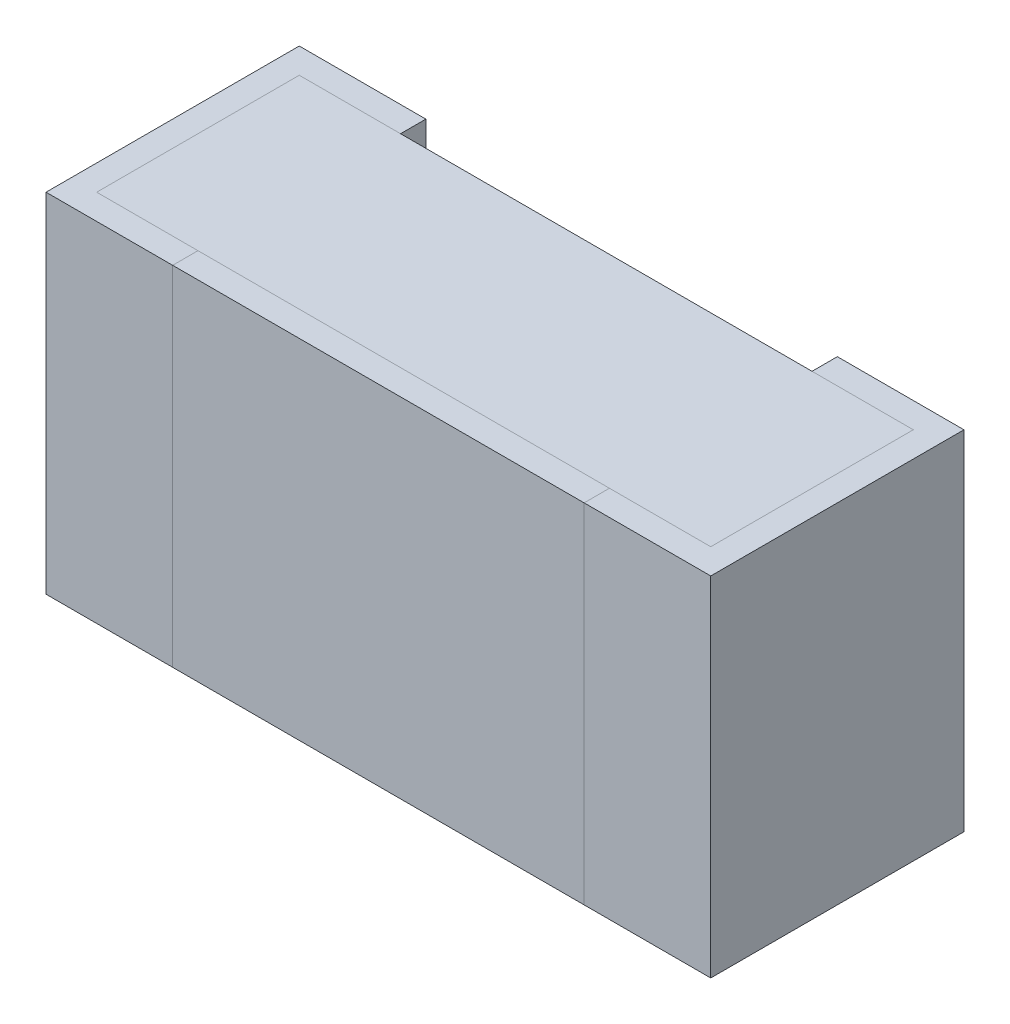
ISO-10303-21;
HEADER;
FILE_DESCRIPTION(('STEP AP214'),'2;1');
FILE_NAME('part.step','',(''),(''),'','','');
FILE_SCHEMA(('AUTOMOTIVE_DESIGN { 1 0 10303 214 1 1 1 1 }'));
ENDSEC;
DATA;
#1=APPLICATION_CONTEXT('core data for automotive mechanical design processes');
#2=APPLICATION_PROTOCOL_DEFINITION('international standard','automotive_design',2000,#1);
#3=PRODUCT_CONTEXT('',#1,'mechanical');
#4=PRODUCT('Part','Part','',(#3));
#5=PRODUCT_RELATED_PRODUCT_CATEGORY('part','',(#4));
#6=PRODUCT_DEFINITION_FORMATION('','',#4);
#7=PRODUCT_DEFINITION_CONTEXT('part definition',#1,'design');
#8=PRODUCT_DEFINITION('design','',#6,#7);
#9=PRODUCT_DEFINITION_SHAPE('','',#8);
#10=(LENGTH_UNIT() NAMED_UNIT(*) SI_UNIT(.MILLI.,.METRE.));
#11=(NAMED_UNIT(*) PLANE_ANGLE_UNIT() SI_UNIT($,.RADIAN.));
#12=(NAMED_UNIT(*) SI_UNIT($,.STERADIAN.) SOLID_ANGLE_UNIT());
#13=UNCERTAINTY_MEASURE_WITH_UNIT(LENGTH_MEASURE(1.E-05),#10,'distance_accuracy_value','');
#14=(GEOMETRIC_REPRESENTATION_CONTEXT(3) GLOBAL_UNCERTAINTY_ASSIGNED_CONTEXT((#13)) GLOBAL_UNIT_ASSIGNED_CONTEXT((#10,
#11,#12)) REPRESENTATION_CONTEXT('',''));
#15=CARTESIAN_POINT('',(0.,0.,0.));
#16=DIRECTION('',(0.,0.,1.));
#17=DIRECTION('',(1.,0.,0.));
#18=AXIS2_PLACEMENT_3D('',#15,#16,#17);
#19=CARTESIAN_POINT('',(-0.462648,-0.21700672,0.04));
#20=DIRECTION('',(1.,0.,0.));
#21=DIRECTION('',(0.,0.,1.));
#22=AXIS2_PLACEMENT_3D('',#19,#20,#21);
#23=PLANE('',#22);
#24=DIRECTION('',(0.,1.,0.));
#25=VECTOR('',#24,1.);
#26=CARTESIAN_POINT('',(-0.462648,-0.21700672,0.36));
#27=LINE('',#26,#25);
#28=CARTESIAN_POINT('',(-0.462648,-0.21700672,0.36));
#29=VERTEX_POINT('',#28);
#30=CARTESIAN_POINT('',(-0.462648,0.33299328,0.36));
#31=VERTEX_POINT('',#30);
#32=EDGE_CURVE('P0_E11',#29,#31,#27,.T.);
#33=ORIENTED_EDGE('',*,*,#32,.T.);
#34=DIRECTION('',(0.,0.,1.));
#35=VECTOR('',#34,1.);
#36=CARTESIAN_POINT('',(-0.462648,0.33299328,0.04));
#37=LINE('',#36,#35);
#38=CARTESIAN_POINT('',(-0.462648,0.33299328,0.04));
#39=VERTEX_POINT('',#38);
#40=EDGE_CURVE('P0_E24',#39,#31,#37,.T.);
#41=ORIENTED_EDGE('',*,*,#40,.F.);
#42=DIRECTION('',(0.,1.,0.));
#43=VECTOR('',#42,1.);
#44=CARTESIAN_POINT('',(-0.462648,-0.21700672,0.04));
#45=LINE('',#44,#43);
#46=CARTESIAN_POINT('',(-0.462648,-0.21700672,0.04));
#47=VERTEX_POINT('',#46);
#48=EDGE_CURVE('P0_E86',#47,#39,#45,.T.);
#49=ORIENTED_EDGE('',*,*,#48,.F.);
#50=DIRECTION('',(0.,0.,1.));
#51=VECTOR('',#50,1.);
#52=CARTESIAN_POINT('',(-0.462648,-0.21700672,0.04));
#53=LINE('',#52,#51);
#54=EDGE_CURVE('P0_E36',#47,#29,#53,.T.);
#55=ORIENTED_EDGE('',*,*,#54,.T.);
#56=EDGE_LOOP('',(#33,#41,#49,#55));
#57=FACE_BOUND('',#56,.T.);
#58=ADVANCED_FACE('P0_F17',(#57),#23,.F.);
#59=CARTESIAN_POINT('',(0.507352,-0.21700672,0.04));
#60=DIRECTION('',(1.,0.,0.));
#61=DIRECTION('',(0.,0.,1.));
#62=AXIS2_PLACEMENT_3D('',#59,#60,#61);
#63=PLANE('',#62);
#64=DIRECTION('',(0.,0.,1.));
#65=VECTOR('',#64,1.);
#66=CARTESIAN_POINT('',(0.507352,-0.21700672,0.04));
#67=LINE('',#66,#65);
#68=CARTESIAN_POINT('',(0.507352,-0.21700672,0.04));
#69=VERTEX_POINT('',#68);
#70=CARTESIAN_POINT('',(0.507352,-0.21700672,0.36));
#71=VERTEX_POINT('',#70);
#72=EDGE_CURVE('P0_E83',#69,#71,#67,.T.);
#73=ORIENTED_EDGE('',*,*,#72,.F.);
#74=DIRECTION('',(0.,1.,0.));
#75=VECTOR('',#74,1.);
#76=CARTESIAN_POINT('',(0.507352,-0.21700672,0.04));
#77=LINE('',#76,#75);
#78=CARTESIAN_POINT('',(0.507352,0.33299328,0.04));
#79=VERTEX_POINT('',#78);
#80=EDGE_CURVE('P0_E63',#69,#79,#77,.T.);
#81=ORIENTED_EDGE('',*,*,#80,.T.);
#82=DIRECTION('',(0.,0.,1.));
#83=VECTOR('',#82,1.);
#84=CARTESIAN_POINT('',(0.507352,0.33299328,0.04));
#85=LINE('',#84,#83);
#86=CARTESIAN_POINT('',(0.507352,0.33299328,0.36));
#87=VERTEX_POINT('',#86);
#88=EDGE_CURVE('P0_E57',#79,#87,#85,.T.);
#89=ORIENTED_EDGE('',*,*,#88,.T.);
#90=DIRECTION('',(0.,1.,0.));
#91=VECTOR('',#90,1.);
#92=CARTESIAN_POINT('',(0.507352,-0.21700672,0.36));
#93=LINE('',#92,#91);
#94=EDGE_CURVE('P0_E60',#71,#87,#93,.T.);
#95=ORIENTED_EDGE('',*,*,#94,.F.);
#96=EDGE_LOOP('',(#73,#81,#89,#95));
#97=FACE_BOUND('',#96,.T.);
#98=ADVANCED_FACE('P0_F59',(#97),#63,.T.);
#99=CARTESIAN_POINT('',(-0.462648,-0.21700672,0.04));
#100=DIRECTION('',(0.,1.,0.));
#101=DIRECTION('',(0.,0.,1.));
#102=AXIS2_PLACEMENT_3D('',#99,#100,#101);
#103=PLANE('',#102);
#104=ORIENTED_EDGE('',*,*,#72,.T.);
#105=DIRECTION('',(1.,0.,0.));
#106=VECTOR('',#105,1.);
#107=CARTESIAN_POINT('',(-0.462648,-0.21700672,0.36));
#108=LINE('',#107,#106);
#109=EDGE_CURVE('P0_E71',#29,#71,#108,.T.);
#110=ORIENTED_EDGE('',*,*,#109,.F.);
#111=ORIENTED_EDGE('',*,*,#54,.F.);
#112=DIRECTION('',(1.,0.,0.));
#113=VECTOR('',#112,1.);
#114=CARTESIAN_POINT('',(-0.462648,-0.21700672,0.04));
#115=LINE('',#114,#113);
#116=EDGE_CURVE('P0_E76',#47,#69,#115,.T.);
#117=ORIENTED_EDGE('',*,*,#116,.T.);
#118=EDGE_LOOP('',(#104,#110,#111,#117));
#119=FACE_BOUND('',#118,.T.);
#120=ADVANCED_FACE('P0_F91',(#119),#103,.F.);
#121=CARTESIAN_POINT('',(-0.462648,0.33299328,0.04));
#122=DIRECTION('',(0.,1.,0.));
#123=DIRECTION('',(0.,0.,1.));
#124=AXIS2_PLACEMENT_3D('',#121,#122,#123);
#125=PLANE('',#124);
#126=DIRECTION('',(1.,0.,0.));
#127=VECTOR('',#126,1.);
#128=CARTESIAN_POINT('',(-0.462648,0.33299328,0.04));
#129=LINE('',#128,#127);
#130=EDGE_CURVE('P0_E74',#39,#79,#129,.T.);
#131=ORIENTED_EDGE('',*,*,#130,.F.);
#132=ORIENTED_EDGE('',*,*,#40,.T.);
#133=DIRECTION('',(1.,0.,0.));
#134=VECTOR('',#133,1.);
#135=CARTESIAN_POINT('',(-0.462648,0.33299328,0.36));
#136=LINE('',#135,#134);
#137=EDGE_CURVE('P0_E69',#31,#87,#136,.T.);
#138=ORIENTED_EDGE('',*,*,#137,.T.);
#139=ORIENTED_EDGE('',*,*,#88,.F.);
#140=EDGE_LOOP('',(#131,#132,#138,#139));
#141=FACE_BOUND('',#140,.T.);
#142=ADVANCED_FACE('P0_F73',(#141),#125,.T.);
#143=CARTESIAN_POINT('',(-0.462648,-0.21700672,0.04));
#144=DIRECTION('',(0.,0.,1.));
#145=DIRECTION('',(1.,0.,0.));
#146=AXIS2_PLACEMENT_3D('',#143,#144,#145);
#147=PLANE('',#146);
#148=ORIENTED_EDGE('',*,*,#130,.T.);
#149=ORIENTED_EDGE('',*,*,#80,.F.);
#150=ORIENTED_EDGE('',*,*,#116,.F.);
#151=ORIENTED_EDGE('',*,*,#48,.T.);
#152=EDGE_LOOP('',(#148,#149,#150,#151));
#153=FACE_BOUND('',#152,.T.);
#154=ADVANCED_FACE('P0_F89',(#153),#147,.F.);
#155=CARTESIAN_POINT('',(-0.462648,-0.21700672,0.36));
#156=DIRECTION('',(0.,0.,1.));
#157=DIRECTION('',(1.,0.,0.));
#158=AXIS2_PLACEMENT_3D('',#155,#156,#157);
#159=PLANE('',#158);
#160=ORIENTED_EDGE('',*,*,#32,.F.);
#161=ORIENTED_EDGE('',*,*,#109,.T.);
#162=ORIENTED_EDGE('',*,*,#94,.T.);
#163=ORIENTED_EDGE('',*,*,#137,.F.);
#164=EDGE_LOOP('',(#160,#161,#162,#163));
#165=FACE_BOUND('',#164,.T.);
#166=ADVANCED_FACE('P0_F68',(#165),#159,.T.);
#167=CLOSED_SHELL('',(#58,#98,#120,#142,#154,#166));
#168=MANIFOLD_SOLID_BREP('P0_B1',#167);
#169=CARTESIAN_POINT('',(-0.502648,-0.21700672,0.));
#170=DIRECTION('',(1.,0.,0.));
#171=DIRECTION('',(0.,0.,1.));
#172=AXIS2_PLACEMENT_3D('',#169,#170,#171);
#173=PLANE('',#172);
#174=DIRECTION('',(0.,1.,0.));
#175=VECTOR('',#174,1.);
#176=CARTESIAN_POINT('',(-0.502648,-0.21700672,0.4));
#177=LINE('',#176,#175);
#178=CARTESIAN_POINT('',(-0.502648,-0.21700672,0.4));
#179=VERTEX_POINT('',#178);
#180=CARTESIAN_POINT('',(-0.502648,0.33299328,0.4));
#181=VERTEX_POINT('',#180);
#182=EDGE_CURVE('P1_E11',#179,#181,#177,.T.);
#183=ORIENTED_EDGE('',*,*,#182,.T.);
#184=DIRECTION('',(0.,0.,1.));
#185=VECTOR('',#184,1.);
#186=CARTESIAN_POINT('',(-0.502648,0.33299328,0.));
#187=LINE('',#186,#185);
#188=CARTESIAN_POINT('',(-0.502648,0.33299328,0.));
#189=VERTEX_POINT('',#188);
#190=EDGE_CURVE('P1_E24',#189,#181,#187,.T.);
#191=ORIENTED_EDGE('',*,*,#190,.F.);
#192=DIRECTION('',(0.,1.,0.));
#193=VECTOR('',#192,1.);
#194=CARTESIAN_POINT('',(-0.502648,-0.21700672,0.));
#195=LINE('',#194,#193);
#196=CARTESIAN_POINT('',(-0.502648,-0.21700672,0.));
#197=VERTEX_POINT('',#196);
#198=EDGE_CURVE('P1_E141',#197,#189,#195,.T.);
#199=ORIENTED_EDGE('',*,*,#198,.F.);
#200=DIRECTION('',(0.,0.,1.));
#201=VECTOR('',#200,1.);
#202=CARTESIAN_POINT('',(-0.502648,-0.21700672,0.));
#203=LINE('',#202,#201);
#204=EDGE_CURVE('P1_E38',#197,#179,#203,.T.);
#205=ORIENTED_EDGE('',*,*,#204,.T.);
#206=EDGE_LOOP('',(#183,#191,#199,#205));
#207=FACE_BOUND('',#206,.T.);
#208=ADVANCED_FACE('P1_F17',(#207),#173,.F.);
#209=CARTESIAN_POINT('',(-0.502648,-0.21700672,0.));
#210=DIRECTION('',(0.,1.,0.));
#211=DIRECTION('',(0.,0.,1.));
#212=AXIS2_PLACEMENT_3D('',#209,#210,#211);
#213=PLANE('',#212);
#214=DIRECTION('',(1.,0.,0.));
#215=VECTOR('',#214,1.);
#216=CARTESIAN_POINT('',(-0.462648,-0.21700672,0.04));
#217=LINE('',#216,#215);
#218=CARTESIAN_POINT('',(-0.462648,-0.21700672,0.04));
#219=VERTEX_POINT('',#218);
#220=CARTESIAN_POINT('',(-0.302648,-0.21700672,0.04));
#221=VERTEX_POINT('',#220);
#222=EDGE_CURVE('P1_E138',#219,#221,#217,.T.);
#223=ORIENTED_EDGE('',*,*,#222,.F.);
#224=DIRECTION('',(0.,0.,1.));
#225=VECTOR('',#224,1.);
#226=CARTESIAN_POINT('',(-0.462648,-0.21700672,0.04));
#227=LINE('',#226,#225);
#228=CARTESIAN_POINT('',(-0.462648,-0.21700672,0.36));
#229=VERTEX_POINT('',#228);
#230=EDGE_CURVE('P1_E99',#219,#229,#227,.T.);
#231=ORIENTED_EDGE('',*,*,#230,.T.);
#232=DIRECTION('',(1.,0.,0.));
#233=VECTOR('',#232,1.);
#234=CARTESIAN_POINT('',(-0.462648,-0.21700672,0.36));
#235=LINE('',#234,#233);
#236=CARTESIAN_POINT('',(-0.302648,-0.21700672,0.36));
#237=VERTEX_POINT('',#236);
#238=EDGE_CURVE('P1_E134',#229,#237,#235,.T.);
#239=ORIENTED_EDGE('',*,*,#238,.T.);
#240=DIRECTION('',(0.,0.,1.));
#241=VECTOR('',#240,1.);
#242=CARTESIAN_POINT('',(-0.302648,-0.21700672,0.));
#243=LINE('',#242,#241);
#244=CARTESIAN_POINT('',(-0.302648,-0.21700672,0.4));
#245=VERTEX_POINT('',#244);
#246=EDGE_CURVE('P1_E131',#237,#245,#243,.T.);
#247=ORIENTED_EDGE('',*,*,#246,.T.);
#248=DIRECTION('',(1.,0.,0.));
#249=VECTOR('',#248,1.);
#250=CARTESIAN_POINT('',(-0.502648,-0.21700672,0.4));
#251=LINE('',#250,#249);
#252=EDGE_CURVE('P1_E129',#179,#245,#251,.T.);
#253=ORIENTED_EDGE('',*,*,#252,.F.);
#254=ORIENTED_EDGE('',*,*,#204,.F.);
#255=DIRECTION('',(1.,0.,0.));
#256=VECTOR('',#255,1.);
#257=CARTESIAN_POINT('',(-0.502648,-0.21700672,0.));
#258=LINE('',#257,#256);
#259=CARTESIAN_POINT('',(-0.302648,-0.21700672,0.));
#260=VERTEX_POINT('',#259);
#261=EDGE_CURVE('P1_E126',#197,#260,#258,.T.);
#262=ORIENTED_EDGE('',*,*,#261,.T.);
#263=DIRECTION('',(0.,0.,1.));
#264=VECTOR('',#263,1.);
#265=CARTESIAN_POINT('',(-0.302648,-0.21700672,0.));
#266=LINE('',#265,#264);
#267=EDGE_CURVE('P1_E123',#260,#221,#266,.T.);
#268=ORIENTED_EDGE('',*,*,#267,.T.);
#269=EDGE_LOOP('',(#223,#231,#239,#247,#253,#254,#262,#268));
#270=FACE_BOUND('',#269,.T.);
#271=ADVANCED_FACE('P1_F147',(#270),#213,.F.);
#272=CARTESIAN_POINT('',(-0.502648,-0.21700672,0.4));
#273=DIRECTION('',(0.,0.,1.));
#274=DIRECTION('',(1.,0.,0.));
#275=AXIS2_PLACEMENT_3D('',#272,#273,#274);
#276=PLANE('',#275);
#277=ORIENTED_EDGE('',*,*,#182,.F.);
#278=ORIENTED_EDGE('',*,*,#252,.T.);
#279=DIRECTION('',(0.,1.,0.));
#280=VECTOR('',#279,1.);
#281=CARTESIAN_POINT('',(-0.302648,-0.21700672,0.4));
#282=LINE('',#281,#280);
#283=CARTESIAN_POINT('',(-0.302648,0.33299328,0.4));
#284=VERTEX_POINT('',#283);
#285=EDGE_CURVE('P1_E121',#245,#284,#282,.T.);
#286=ORIENTED_EDGE('',*,*,#285,.T.);
#287=DIRECTION('',(1.,0.,0.));
#288=VECTOR('',#287,1.);
#289=CARTESIAN_POINT('',(-0.502648,0.33299328,0.4));
#290=LINE('',#289,#288);
#291=EDGE_CURVE('P1_E31',#181,#284,#290,.T.);
#292=ORIENTED_EDGE('',*,*,#291,.F.);
#293=EDGE_LOOP('',(#277,#278,#286,#292));
#294=FACE_BOUND('',#293,.T.);
#295=ADVANCED_FACE('P1_F144',(#294),#276,.T.);
#296=CARTESIAN_POINT('',(-0.502648,0.33299328,0.));
#297=DIRECTION('',(0.,1.,0.));
#298=DIRECTION('',(0.,0.,1.));
#299=AXIS2_PLACEMENT_3D('',#296,#297,#298);
#300=PLANE('',#299);
#301=DIRECTION('',(0.,0.,1.));
#302=VECTOR('',#301,1.);
#303=CARTESIAN_POINT('',(-0.302648,0.33299328,0.));
#304=LINE('',#303,#302);
#305=CARTESIAN_POINT('',(-0.302648,0.33299328,0.));
#306=VERTEX_POINT('',#305);
#307=CARTESIAN_POINT('',(-0.302648,0.33299328,0.04));
#308=VERTEX_POINT('',#307);
#309=EDGE_CURVE('P1_E118',#306,#308,#304,.T.);
#310=ORIENTED_EDGE('',*,*,#309,.F.);
#311=DIRECTION('',(1.,0.,0.));
#312=VECTOR('',#311,1.);
#313=CARTESIAN_POINT('',(-0.502648,0.33299328,0.));
#314=LINE('',#313,#312);
#315=EDGE_CURVE('P1_E115',#189,#306,#314,.T.);
#316=ORIENTED_EDGE('',*,*,#315,.F.);
#317=ORIENTED_EDGE('',*,*,#190,.T.);
#318=ORIENTED_EDGE('',*,*,#291,.T.);
#319=DIRECTION('',(0.,0.,1.));
#320=VECTOR('',#319,1.);
#321=CARTESIAN_POINT('',(-0.302648,0.33299328,0.));
#322=LINE('',#321,#320);
#323=CARTESIAN_POINT('',(-0.302648,0.33299328,0.36));
#324=VERTEX_POINT('',#323);
#325=EDGE_CURVE('P1_E109',#324,#284,#322,.T.);
#326=ORIENTED_EDGE('',*,*,#325,.F.);
#327=DIRECTION('',(1.,0.,0.));
#328=VECTOR('',#327,1.);
#329=CARTESIAN_POINT('',(-0.462648,0.33299328,0.36));
#330=LINE('',#329,#328);
#331=CARTESIAN_POINT('',(-0.462648,0.33299328,0.36));
#332=VERTEX_POINT('',#331);
#333=EDGE_CURVE('P1_E107',#332,#324,#330,.T.);
#334=ORIENTED_EDGE('',*,*,#333,.F.);
#335=DIRECTION('',(0.,0.,1.));
#336=VECTOR('',#335,1.);
#337=CARTESIAN_POINT('',(-0.462648,0.33299328,0.04));
#338=LINE('',#337,#336);
#339=CARTESIAN_POINT('',(-0.462648,0.33299328,0.04));
#340=VERTEX_POINT('',#339);
#341=EDGE_CURVE('P1_E92',#340,#332,#338,.T.);
#342=ORIENTED_EDGE('',*,*,#341,.F.);
#343=DIRECTION('',(1.,0.,0.));
#344=VECTOR('',#343,1.);
#345=CARTESIAN_POINT('',(-0.462648,0.33299328,0.04));
#346=LINE('',#345,#344);
#347=EDGE_CURVE('P1_E81',#340,#308,#346,.T.);
#348=ORIENTED_EDGE('',*,*,#347,.T.);
#349=EDGE_LOOP('',(#310,#316,#317,#318,#326,#334,#342,#348));
#350=FACE_BOUND('',#349,.T.);
#351=ADVANCED_FACE('P1_F104',(#350),#300,.T.);
#352=CARTESIAN_POINT('',(-0.502648,-0.21700672,0.));
#353=DIRECTION('',(0.,0.,1.));
#354=DIRECTION('',(1.,0.,0.));
#355=AXIS2_PLACEMENT_3D('',#352,#353,#354);
#356=PLANE('',#355);
#357=ORIENTED_EDGE('',*,*,#315,.T.);
#358=DIRECTION('',(0.,1.,0.));
#359=VECTOR('',#358,1.);
#360=CARTESIAN_POINT('',(-0.302648,-0.21700672,0.));
#361=LINE('',#360,#359);
#362=EDGE_CURVE('P1_E93',#260,#306,#361,.T.);
#363=ORIENTED_EDGE('',*,*,#362,.F.);
#364=ORIENTED_EDGE('',*,*,#261,.F.);
#365=ORIENTED_EDGE('',*,*,#198,.T.);
#366=EDGE_LOOP('',(#357,#363,#364,#365));
#367=FACE_BOUND('',#366,.T.);
#368=ADVANCED_FACE('P1_F163',(#367),#356,.F.);
#369=CARTESIAN_POINT('',(-0.302648,-0.21700672,0.));
#370=DIRECTION('',(1.,0.,0.));
#371=DIRECTION('',(0.,0.,1.));
#372=AXIS2_PLACEMENT_3D('',#369,#370,#371);
#373=PLANE('',#372);
#374=ORIENTED_EDGE('',*,*,#267,.F.);
#375=ORIENTED_EDGE('',*,*,#362,.T.);
#376=ORIENTED_EDGE('',*,*,#309,.T.);
#377=DIRECTION('',(0.,-1.,0.));
#378=VECTOR('',#377,1.);
#379=CARTESIAN_POINT('',(-0.302648,-0.21700672,0.04));
#380=LINE('',#379,#378);
#381=EDGE_CURVE('P1_E87',#308,#221,#380,.T.);
#382=ORIENTED_EDGE('',*,*,#381,.T.);
#383=EDGE_LOOP('',(#374,#375,#376,#382));
#384=FACE_BOUND('',#383,.T.);
#385=ADVANCED_FACE('P1_F160',(#384),#373,.T.);
#386=CARTESIAN_POINT('',(-0.462648,-0.21700672,0.04));
#387=DIRECTION('',(0.,0.,1.));
#388=DIRECTION('',(1.,0.,0.));
#389=AXIS2_PLACEMENT_3D('',#386,#387,#388);
#390=PLANE('',#389);
#391=ORIENTED_EDGE('',*,*,#347,.F.);
#392=DIRECTION('',(0.,1.,0.));
#393=VECTOR('',#392,1.);
#394=CARTESIAN_POINT('',(-0.462648,-0.21700672,0.04));
#395=LINE('',#394,#393);
#396=EDGE_CURVE('P1_E84',#219,#340,#395,.T.);
#397=ORIENTED_EDGE('',*,*,#396,.F.);
#398=ORIENTED_EDGE('',*,*,#222,.T.);
#399=ORIENTED_EDGE('',*,*,#381,.F.);
#400=EDGE_LOOP('',(#391,#397,#398,#399));
#401=FACE_BOUND('',#400,.T.);
#402=ADVANCED_FACE('P1_F83',(#401),#390,.T.);
#403=CARTESIAN_POINT('',(-0.462648,-0.21700672,0.04));
#404=DIRECTION('',(1.,0.,0.));
#405=DIRECTION('',(0.,0.,1.));
#406=AXIS2_PLACEMENT_3D('',#403,#404,#405);
#407=PLANE('',#406);
#408=ORIENTED_EDGE('',*,*,#230,.F.);
#409=ORIENTED_EDGE('',*,*,#396,.T.);
#410=ORIENTED_EDGE('',*,*,#341,.T.);
#411=DIRECTION('',(0.,1.,0.));
#412=VECTOR('',#411,1.);
#413=CARTESIAN_POINT('',(-0.462648,-0.21700672,0.36));
#414=LINE('',#413,#412);
#415=EDGE_CURVE('P1_E101',#229,#332,#414,.T.);
#416=ORIENTED_EDGE('',*,*,#415,.F.);
#417=EDGE_LOOP('',(#408,#409,#410,#416));
#418=FACE_BOUND('',#417,.T.);
#419=ADVANCED_FACE('P1_F97',(#418),#407,.T.);
#420=CARTESIAN_POINT('',(-0.462648,-0.21700672,0.36));
#421=DIRECTION('',(0.,0.,1.));
#422=DIRECTION('',(1.,0.,0.));
#423=AXIS2_PLACEMENT_3D('',#420,#421,#422);
#424=PLANE('',#423);
#425=DIRECTION('',(0.,-1.,0.));
#426=VECTOR('',#425,1.);
#427=CARTESIAN_POINT('',(-0.302648,-0.21700672,0.36));
#428=LINE('',#427,#426);
#429=EDGE_CURVE('P1_E152',#324,#237,#428,.T.);
#430=ORIENTED_EDGE('',*,*,#429,.T.);
#431=ORIENTED_EDGE('',*,*,#238,.F.);
#432=ORIENTED_EDGE('',*,*,#415,.T.);
#433=ORIENTED_EDGE('',*,*,#333,.T.);
#434=EDGE_LOOP('',(#430,#431,#432,#433));
#435=FACE_BOUND('',#434,.T.);
#436=ADVANCED_FACE('P1_F154',(#435),#424,.F.);
#437=CARTESIAN_POINT('',(-0.302648,-0.21700672,0.));
#438=DIRECTION('',(1.,0.,0.));
#439=DIRECTION('',(0.,0.,1.));
#440=AXIS2_PLACEMENT_3D('',#437,#438,#439);
#441=PLANE('',#440);
#442=ORIENTED_EDGE('',*,*,#246,.F.);
#443=ORIENTED_EDGE('',*,*,#429,.F.);
#444=ORIENTED_EDGE('',*,*,#325,.T.);
#445=ORIENTED_EDGE('',*,*,#285,.F.);
#446=EDGE_LOOP('',(#442,#443,#444,#445));
#447=FACE_BOUND('',#446,.T.);
#448=ADVANCED_FACE('P1_F151',(#447),#441,.T.);
#449=CLOSED_SHELL('',(#208,#271,#295,#351,#368,#385,#402,#419,#436,#448));
#450=MANIFOLD_SOLID_BREP('P1_B1',#449);
#451=CARTESIAN_POINT('',(0.547352,0.33299328,0.));
#452=DIRECTION('',(-1.,0.,0.));
#453=DIRECTION('',(0.,0.,1.));
#454=AXIS2_PLACEMENT_3D('',#451,#452,#453);
#455=PLANE('',#454);
#456=DIRECTION('',(0.,-1.,0.));
#457=VECTOR('',#456,1.);
#458=CARTESIAN_POINT('',(0.547352,0.33299328,0.4));
#459=LINE('',#458,#457);
#460=CARTESIAN_POINT('',(0.547352,0.33299328,0.4));
#461=VERTEX_POINT('',#460);
#462=CARTESIAN_POINT('',(0.547352,-0.21700672,0.4));
#463=VERTEX_POINT('',#462);
#464=EDGE_CURVE('P2_E11',#461,#463,#459,.T.);
#465=ORIENTED_EDGE('',*,*,#464,.T.);
#466=DIRECTION('',(0.,0.,1.));
#467=VECTOR('',#466,1.);
#468=CARTESIAN_POINT('',(0.547352,-0.21700672,0.));
#469=LINE('',#468,#467);
#470=CARTESIAN_POINT('',(0.547352,-0.21700672,0.));
#471=VERTEX_POINT('',#470);
#472=EDGE_CURVE('P2_E24',#471,#463,#469,.T.);
#473=ORIENTED_EDGE('',*,*,#472,.F.);
#474=DIRECTION('',(0.,-1.,0.));
#475=VECTOR('',#474,1.);
#476=CARTESIAN_POINT('',(0.547352,0.33299328,0.));
#477=LINE('',#476,#475);
#478=CARTESIAN_POINT('',(0.547352,0.33299328,0.));
#479=VERTEX_POINT('',#478);
#480=EDGE_CURVE('P2_E139',#479,#471,#477,.T.);
#481=ORIENTED_EDGE('',*,*,#480,.F.);
#482=DIRECTION('',(0.,0.,1.));
#483=VECTOR('',#482,1.);
#484=CARTESIAN_POINT('',(0.547352,0.33299328,0.));
#485=LINE('',#484,#483);
#486=EDGE_CURVE('P2_E37',#479,#461,#485,.T.);
#487=ORIENTED_EDGE('',*,*,#486,.T.);
#488=EDGE_LOOP('',(#465,#473,#481,#487));
#489=FACE_BOUND('',#488,.T.);
#490=ADVANCED_FACE('P2_F17',(#489),#455,.F.);
#491=CARTESIAN_POINT('',(0.547352,0.33299328,0.));
#492=DIRECTION('',(0.,-1.,0.));
#493=DIRECTION('',(0.,0.,1.));
#494=AXIS2_PLACEMENT_3D('',#491,#492,#493);
#495=PLANE('',#494);
#496=DIRECTION('',(-1.,0.,0.));
#497=VECTOR('',#496,1.);
#498=CARTESIAN_POINT('',(0.507352,0.33299328,0.04));
#499=LINE('',#498,#497);
#500=CARTESIAN_POINT('',(0.507352,0.33299328,0.04));
#501=VERTEX_POINT('',#500);
#502=CARTESIAN_POINT('',(0.347352,0.33299328,0.04));
#503=VERTEX_POINT('',#502);
#504=EDGE_CURVE('P2_E136',#501,#503,#499,.T.);
#505=ORIENTED_EDGE('',*,*,#504,.F.);
#506=DIRECTION('',(0.,0.,1.));
#507=VECTOR('',#506,1.);
#508=CARTESIAN_POINT('',(0.507352,0.33299328,0.04));
#509=LINE('',#508,#507);
#510=CARTESIAN_POINT('',(0.507352,0.33299328,0.36));
#511=VERTEX_POINT('',#510);
#512=EDGE_CURVE('P2_E101',#501,#511,#509,.T.);
#513=ORIENTED_EDGE('',*,*,#512,.T.);
#514=DIRECTION('',(-1.,0.,0.));
#515=VECTOR('',#514,1.);
#516=CARTESIAN_POINT('',(0.507352,0.33299328,0.36));
#517=LINE('',#516,#515);
#518=CARTESIAN_POINT('',(0.347352,0.33299328,0.36));
#519=VERTEX_POINT('',#518);
#520=EDGE_CURVE('P2_E132',#511,#519,#517,.T.);
#521=ORIENTED_EDGE('',*,*,#520,.T.);
#522=DIRECTION('',(0.,0.,1.));
#523=VECTOR('',#522,1.);
#524=CARTESIAN_POINT('',(0.347352,0.33299328,0.));
#525=LINE('',#524,#523);
#526=CARTESIAN_POINT('',(0.347352,0.33299328,0.4));
#527=VERTEX_POINT('',#526);
#528=EDGE_CURVE('P2_E129',#519,#527,#525,.T.);
#529=ORIENTED_EDGE('',*,*,#528,.T.);
#530=DIRECTION('',(-1.,0.,0.));
#531=VECTOR('',#530,1.);
#532=CARTESIAN_POINT('',(0.547352,0.33299328,0.4));
#533=LINE('',#532,#531);
#534=EDGE_CURVE('P2_E127',#461,#527,#533,.T.);
#535=ORIENTED_EDGE('',*,*,#534,.F.);
#536=ORIENTED_EDGE('',*,*,#486,.F.);
#537=DIRECTION('',(-1.,0.,0.));
#538=VECTOR('',#537,1.);
#539=CARTESIAN_POINT('',(0.547352,0.33299328,0.));
#540=LINE('',#539,#538);
#541=CARTESIAN_POINT('',(0.347352,0.33299328,0.));
#542=VERTEX_POINT('',#541);
#543=EDGE_CURVE('P2_E124',#479,#542,#540,.T.);
#544=ORIENTED_EDGE('',*,*,#543,.T.);
#545=DIRECTION('',(0.,0.,1.));
#546=VECTOR('',#545,1.);
#547=CARTESIAN_POINT('',(0.347352,0.33299328,0.));
#548=LINE('',#547,#546);
#549=EDGE_CURVE('P2_E122',#542,#503,#548,.T.);
#550=ORIENTED_EDGE('',*,*,#549,.T.);
#551=EDGE_LOOP('',(#505,#513,#521,#529,#535,#536,#544,#550));
#552=FACE_BOUND('',#551,.T.);
#553=ADVANCED_FACE('P2_F147',(#552),#495,.F.);
#554=CARTESIAN_POINT('',(0.547352,0.33299328,0.4));
#555=DIRECTION('',(0.,0.,1.));
#556=DIRECTION('',(-1.,0.,0.));
#557=AXIS2_PLACEMENT_3D('',#554,#555,#556);
#558=PLANE('',#557);
#559=ORIENTED_EDGE('',*,*,#464,.F.);
#560=ORIENTED_EDGE('',*,*,#534,.T.);
#561=DIRECTION('',(0.,-1.,0.));
#562=VECTOR('',#561,1.);
#563=CARTESIAN_POINT('',(0.347352,0.33299328,0.4));
#564=LINE('',#563,#562);
#565=CARTESIAN_POINT('',(0.347352,-0.21700672,0.4));
#566=VERTEX_POINT('',#565);
#567=EDGE_CURVE('P2_E120',#527,#566,#564,.T.);
#568=ORIENTED_EDGE('',*,*,#567,.T.);
#569=DIRECTION('',(-1.,0.,0.));
#570=VECTOR('',#569,1.);
#571=CARTESIAN_POINT('',(0.547352,-0.21700672,0.4));
#572=LINE('',#571,#570);
#573=EDGE_CURVE('P2_E31',#463,#566,#572,.T.);
#574=ORIENTED_EDGE('',*,*,#573,.F.);
#575=EDGE_LOOP('',(#559,#560,#568,#574));
#576=FACE_BOUND('',#575,.T.);
#577=ADVANCED_FACE('P2_F144',(#576),#558,.T.);
#578=CARTESIAN_POINT('',(0.547352,-0.21700672,0.));
#579=DIRECTION('',(0.,-1.,0.));
#580=DIRECTION('',(0.,0.,1.));
#581=AXIS2_PLACEMENT_3D('',#578,#579,#580);
#582=PLANE('',#581);
#583=DIRECTION('',(0.,0.,1.));
#584=VECTOR('',#583,1.);
#585=CARTESIAN_POINT('',(0.347352,-0.21700672,0.));
#586=LINE('',#585,#584);
#587=CARTESIAN_POINT('',(0.347352,-0.21700672,0.));
#588=VERTEX_POINT('',#587);
#589=CARTESIAN_POINT('',(0.347352,-0.21700672,0.04));
#590=VERTEX_POINT('',#589);
#591=EDGE_CURVE('P2_E117',#588,#590,#586,.T.);
#592=ORIENTED_EDGE('',*,*,#591,.F.);
#593=DIRECTION('',(-1.,0.,0.));
#594=VECTOR('',#593,1.);
#595=CARTESIAN_POINT('',(0.547352,-0.21700672,0.));
#596=LINE('',#595,#594);
#597=EDGE_CURVE('P2_E114',#471,#588,#596,.T.);
#598=ORIENTED_EDGE('',*,*,#597,.F.);
#599=ORIENTED_EDGE('',*,*,#472,.T.);
#600=ORIENTED_EDGE('',*,*,#573,.T.);
#601=DIRECTION('',(0.,0.,1.));
#602=VECTOR('',#601,1.);
#603=CARTESIAN_POINT('',(0.347352,-0.21700672,0.));
#604=LINE('',#603,#602);
#605=CARTESIAN_POINT('',(0.347352,-0.21700672,0.36));
#606=VERTEX_POINT('',#605);
#607=EDGE_CURVE('P2_E108',#606,#566,#604,.T.);
#608=ORIENTED_EDGE('',*,*,#607,.F.);
#609=DIRECTION('',(-1.,0.,0.));
#610=VECTOR('',#609,1.);
#611=CARTESIAN_POINT('',(0.507352,-0.21700672,0.36));
#612=LINE('',#611,#610);
#613=CARTESIAN_POINT('',(0.507352,-0.21700672,0.36));
#614=VERTEX_POINT('',#613);
#615=EDGE_CURVE('P2_E106',#614,#606,#612,.T.);
#616=ORIENTED_EDGE('',*,*,#615,.F.);
#617=DIRECTION('',(0.,0.,1.));
#618=VECTOR('',#617,1.);
#619=CARTESIAN_POINT('',(0.507352,-0.21700672,0.04));
#620=LINE('',#619,#618);
#621=CARTESIAN_POINT('',(0.507352,-0.21700672,0.04));
#622=VERTEX_POINT('',#621);
#623=EDGE_CURVE('P2_E92',#622,#614,#620,.T.);
#624=ORIENTED_EDGE('',*,*,#623,.F.);
#625=DIRECTION('',(-1.,0.,0.));
#626=VECTOR('',#625,1.);
#627=CARTESIAN_POINT('',(0.507352,-0.21700672,0.04));
#628=LINE('',#627,#626);
#629=EDGE_CURVE('P2_E82',#622,#590,#628,.T.);
#630=ORIENTED_EDGE('',*,*,#629,.T.);
#631=EDGE_LOOP('',(#592,#598,#599,#600,#608,#616,#624,#630));
#632=FACE_BOUND('',#631,.T.);
#633=ADVANCED_FACE('P2_F104',(#632),#582,.T.);
#634=CARTESIAN_POINT('',(0.547352,0.33299328,0.));
#635=DIRECTION('',(0.,0.,1.));
#636=DIRECTION('',(-1.,0.,0.));
#637=AXIS2_PLACEMENT_3D('',#634,#635,#636);
#638=PLANE('',#637);
#639=ORIENTED_EDGE('',*,*,#597,.T.);
#640=DIRECTION('',(0.,-1.,0.));
#641=VECTOR('',#640,1.);
#642=CARTESIAN_POINT('',(0.347352,0.33299328,0.));
#643=LINE('',#642,#641);
#644=EDGE_CURVE('P2_E93',#542,#588,#643,.T.);
#645=ORIENTED_EDGE('',*,*,#644,.F.);
#646=ORIENTED_EDGE('',*,*,#543,.F.);
#647=ORIENTED_EDGE('',*,*,#480,.T.);
#648=EDGE_LOOP('',(#639,#645,#646,#647));
#649=FACE_BOUND('',#648,.T.);
#650=ADVANCED_FACE('P2_F162',(#649),#638,.F.);
#651=CARTESIAN_POINT('',(0.347352,0.33299328,0.));
#652=DIRECTION('',(-1.,0.,0.));
#653=DIRECTION('',(0.,0.,1.));
#654=AXIS2_PLACEMENT_3D('',#651,#652,#653);
#655=PLANE('',#654);
#656=ORIENTED_EDGE('',*,*,#549,.F.);
#657=ORIENTED_EDGE('',*,*,#644,.T.);
#658=ORIENTED_EDGE('',*,*,#591,.T.);
#659=DIRECTION('',(0.,1.,0.));
#660=VECTOR('',#659,1.);
#661=CARTESIAN_POINT('',(0.347352,0.33299328,0.04));
#662=LINE('',#661,#660);
#663=EDGE_CURVE('P2_E89',#590,#503,#662,.T.);
#664=ORIENTED_EDGE('',*,*,#663,.T.);
#665=EDGE_LOOP('',(#656,#657,#658,#664));
#666=FACE_BOUND('',#665,.T.);
#667=ADVANCED_FACE('P2_F160',(#666),#655,.T.);
#668=CARTESIAN_POINT('',(0.507352,0.33299328,0.04));
#669=DIRECTION('',(0.,0.,1.));
#670=DIRECTION('',(-1.,0.,0.));
#671=AXIS2_PLACEMENT_3D('',#668,#669,#670);
#672=PLANE('',#671);
#673=ORIENTED_EDGE('',*,*,#629,.F.);
#674=DIRECTION('',(0.,-1.,0.));
#675=VECTOR('',#674,1.);
#676=CARTESIAN_POINT('',(0.507352,0.33299328,0.04));
#677=LINE('',#676,#675);
#678=EDGE_CURVE('P2_E86',#501,#622,#677,.T.);
#679=ORIENTED_EDGE('',*,*,#678,.F.);
#680=ORIENTED_EDGE('',*,*,#504,.T.);
#681=ORIENTED_EDGE('',*,*,#663,.F.);
#682=EDGE_LOOP('',(#673,#679,#680,#681));
#683=FACE_BOUND('',#682,.T.);
#684=ADVANCED_FACE('P2_F84',(#683),#672,.T.);
#685=CARTESIAN_POINT('',(0.507352,0.33299328,0.04));
#686=DIRECTION('',(-1.,0.,0.));
#687=DIRECTION('',(0.,0.,1.));
#688=AXIS2_PLACEMENT_3D('',#685,#686,#687);
#689=PLANE('',#688);
#690=ORIENTED_EDGE('',*,*,#512,.F.);
#691=ORIENTED_EDGE('',*,*,#678,.T.);
#692=ORIENTED_EDGE('',*,*,#623,.T.);
#693=DIRECTION('',(0.,-1.,0.));
#694=VECTOR('',#693,1.);
#695=CARTESIAN_POINT('',(0.507352,0.33299328,0.36));
#696=LINE('',#695,#694);
#697=EDGE_CURVE('P2_E102',#511,#614,#696,.T.);
#698=ORIENTED_EDGE('',*,*,#697,.F.);
#699=EDGE_LOOP('',(#690,#691,#692,#698));
#700=FACE_BOUND('',#699,.T.);
#701=ADVANCED_FACE('P2_F97',(#700),#689,.T.);
#702=CARTESIAN_POINT('',(0.507352,0.33299328,0.36));
#703=DIRECTION('',(0.,0.,1.));
#704=DIRECTION('',(-1.,0.,0.));
#705=AXIS2_PLACEMENT_3D('',#702,#703,#704);
#706=PLANE('',#705);
#707=DIRECTION('',(0.,1.,0.));
#708=VECTOR('',#707,1.);
#709=CARTESIAN_POINT('',(0.347352,0.33299328,0.36));
#710=LINE('',#709,#708);
#711=EDGE_CURVE('P2_E152',#606,#519,#710,.T.);
#712=ORIENTED_EDGE('',*,*,#711,.T.);
#713=ORIENTED_EDGE('',*,*,#520,.F.);
#714=ORIENTED_EDGE('',*,*,#697,.T.);
#715=ORIENTED_EDGE('',*,*,#615,.T.);
#716=EDGE_LOOP('',(#712,#713,#714,#715));
#717=FACE_BOUND('',#716,.T.);
#718=ADVANCED_FACE('P2_F163',(#717),#706,.F.);
#719=CARTESIAN_POINT('',(0.347352,0.33299328,0.));
#720=DIRECTION('',(-1.,0.,0.));
#721=DIRECTION('',(0.,0.,1.));
#722=AXIS2_PLACEMENT_3D('',#719,#720,#721);
#723=PLANE('',#722);
#724=ORIENTED_EDGE('',*,*,#528,.F.);
#725=ORIENTED_EDGE('',*,*,#711,.F.);
#726=ORIENTED_EDGE('',*,*,#607,.T.);
#727=ORIENTED_EDGE('',*,*,#567,.F.);
#728=EDGE_LOOP('',(#724,#725,#726,#727));
#729=FACE_BOUND('',#728,.T.);
#730=ADVANCED_FACE('P2_F151',(#729),#723,.T.);
#731=CLOSED_SHELL('',(#490,#553,#577,#633,#650,#667,#684,#701,#718,#730));
#732=MANIFOLD_SOLID_BREP('P2_B1',#731);
#733=CARTESIAN_POINT('',(-0.302648,-0.21700672,0.36));
#734=DIRECTION('',(1.,0.,0.));
#735=DIRECTION('',(0.,0.,1.));
#736=AXIS2_PLACEMENT_3D('',#733,#734,#735);
#737=PLANE('',#736);
#738=DIRECTION('',(0.,1.,0.));
#739=VECTOR('',#738,1.);
#740=CARTESIAN_POINT('',(-0.302648,-0.21700672,0.4));
#741=LINE('',#740,#739);
#742=CARTESIAN_POINT('',(-0.302648,-0.21700672,0.4));
#743=VERTEX_POINT('',#742);
#744=CARTESIAN_POINT('',(-0.302648,0.33299328,0.4));
#745=VERTEX_POINT('',#744);
#746=EDGE_CURVE('P3_E10',#743,#745,#741,.T.);
#747=ORIENTED_EDGE('',*,*,#746,.T.);
#748=DIRECTION('',(0.,0.,1.));
#749=VECTOR('',#748,1.);
#750=CARTESIAN_POINT('',(-0.302648,0.33299328,0.36));
#751=LINE('',#750,#749);
#752=CARTESIAN_POINT('',(-0.302648,0.33299328,0.36));
#753=VERTEX_POINT('',#752);
#754=EDGE_CURVE('P3_E23',#753,#745,#751,.T.);
#755=ORIENTED_EDGE('',*,*,#754,.F.);
#756=DIRECTION('',(0.,1.,0.));
#757=VECTOR('',#756,1.);
#758=CARTESIAN_POINT('',(-0.302648,-0.21700672,0.36));
#759=LINE('',#758,#757);
#760=CARTESIAN_POINT('',(-0.302648,-0.21700672,0.36));
#761=VERTEX_POINT('',#760);
#762=EDGE_CURVE('P3_E85',#761,#753,#759,.T.);
#763=ORIENTED_EDGE('',*,*,#762,.F.);
#764=DIRECTION('',(0.,0.,1.));
#765=VECTOR('',#764,1.);
#766=CARTESIAN_POINT('',(-0.302648,-0.21700672,0.36));
#767=LINE('',#766,#765);
#768=EDGE_CURVE('P3_E33',#761,#743,#767,.T.);
#769=ORIENTED_EDGE('',*,*,#768,.T.);
#770=EDGE_LOOP('',(#747,#755,#763,#769));
#771=FACE_BOUND('',#770,.T.);
#772=ADVANCED_FACE('P3_F16',(#771),#737,.F.);
#773=CARTESIAN_POINT('',(0.347352,-0.21700672,0.36));
#774=DIRECTION('',(1.,0.,0.));
#775=DIRECTION('',(0.,0.,1.));
#776=AXIS2_PLACEMENT_3D('',#773,#774,#775);
#777=PLANE('',#776);
#778=DIRECTION('',(0.,0.,1.));
#779=VECTOR('',#778,1.);
#780=CARTESIAN_POINT('',(0.347352,-0.21700672,0.36));
#781=LINE('',#780,#779);
#782=CARTESIAN_POINT('',(0.347352,-0.21700672,0.36));
#783=VERTEX_POINT('',#782);
#784=CARTESIAN_POINT('',(0.347352,-0.21700672,0.4));
#785=VERTEX_POINT('',#784);
#786=EDGE_CURVE('P3_E82',#783,#785,#781,.T.);
#787=ORIENTED_EDGE('',*,*,#786,.F.);
#788=DIRECTION('',(0.,1.,0.));
#789=VECTOR('',#788,1.);
#790=CARTESIAN_POINT('',(0.347352,-0.21700672,0.36));
#791=LINE('',#790,#789);
#792=CARTESIAN_POINT('',(0.347352,0.33299328,0.36));
#793=VERTEX_POINT('',#792);
#794=EDGE_CURVE('P3_E58',#783,#793,#791,.T.);
#795=ORIENTED_EDGE('',*,*,#794,.T.);
#796=DIRECTION('',(0.,0.,1.));
#797=VECTOR('',#796,1.);
#798=CARTESIAN_POINT('',(0.347352,0.33299328,0.36));
#799=LINE('',#798,#797);
#800=CARTESIAN_POINT('',(0.347352,0.33299328,0.4));
#801=VERTEX_POINT('',#800);
#802=EDGE_CURVE('P3_E53',#793,#801,#799,.T.);
#803=ORIENTED_EDGE('',*,*,#802,.T.);
#804=DIRECTION('',(0.,1.,0.));
#805=VECTOR('',#804,1.);
#806=CARTESIAN_POINT('',(0.347352,-0.21700672,0.4));
#807=LINE('',#806,#805);
#808=EDGE_CURVE('P3_E56',#785,#801,#807,.T.);
#809=ORIENTED_EDGE('',*,*,#808,.F.);
#810=EDGE_LOOP('',(#787,#795,#803,#809));
#811=FACE_BOUND('',#810,.T.);
#812=ADVANCED_FACE('P3_F55',(#811),#777,.T.);
#813=CARTESIAN_POINT('',(-0.302648,-0.21700672,0.36));
#814=DIRECTION('',(0.,1.,0.));
#815=DIRECTION('',(0.,0.,1.));
#816=AXIS2_PLACEMENT_3D('',#813,#814,#815);
#817=PLANE('',#816);
#818=ORIENTED_EDGE('',*,*,#786,.T.);
#819=DIRECTION('',(1.,0.,0.));
#820=VECTOR('',#819,1.);
#821=CARTESIAN_POINT('',(-0.302648,-0.21700672,0.4));
#822=LINE('',#821,#820);
#823=EDGE_CURVE('P3_E69',#743,#785,#822,.T.);
#824=ORIENTED_EDGE('',*,*,#823,.F.);
#825=ORIENTED_EDGE('',*,*,#768,.F.);
#826=DIRECTION('',(1.,0.,0.));
#827=VECTOR('',#826,1.);
#828=CARTESIAN_POINT('',(-0.302648,-0.21700672,0.36));
#829=LINE('',#828,#827);
#830=EDGE_CURVE('P3_E75',#761,#783,#829,.T.);
#831=ORIENTED_EDGE('',*,*,#830,.T.);
#832=EDGE_LOOP('',(#818,#824,#825,#831));
#833=FACE_BOUND('',#832,.T.);
#834=ADVANCED_FACE('P3_F94',(#833),#817,.F.);
#835=CARTESIAN_POINT('',(-0.302648,0.33299328,0.36));
#836=DIRECTION('',(0.,1.,0.));
#837=DIRECTION('',(0.,0.,1.));
#838=AXIS2_PLACEMENT_3D('',#835,#836,#837);
#839=PLANE('',#838);
#840=DIRECTION('',(1.,0.,0.));
#841=VECTOR('',#840,1.);
#842=CARTESIAN_POINT('',(-0.302648,0.33299328,0.36));
#843=LINE('',#842,#841);
#844=EDGE_CURVE('P3_E73',#753,#793,#843,.T.);
#845=ORIENTED_EDGE('',*,*,#844,.F.);
#846=ORIENTED_EDGE('',*,*,#754,.T.);
#847=DIRECTION('',(1.,0.,0.));
#848=VECTOR('',#847,1.);
#849=CARTESIAN_POINT('',(-0.302648,0.33299328,0.4));
#850=LINE('',#849,#848);
#851=EDGE_CURVE('P3_E67',#745,#801,#850,.T.);
#852=ORIENTED_EDGE('',*,*,#851,.T.);
#853=ORIENTED_EDGE('',*,*,#802,.F.);
#854=EDGE_LOOP('',(#845,#846,#852,#853));
#855=FACE_BOUND('',#854,.T.);
#856=ADVANCED_FACE('P3_F72',(#855),#839,.T.);
#857=CARTESIAN_POINT('',(-0.302648,-0.21700672,0.36));
#858=DIRECTION('',(0.,0.,1.));
#859=DIRECTION('',(1.,0.,0.));
#860=AXIS2_PLACEMENT_3D('',#857,#858,#859);
#861=PLANE('',#860);
#862=ORIENTED_EDGE('',*,*,#844,.T.);
#863=ORIENTED_EDGE('',*,*,#794,.F.);
#864=ORIENTED_EDGE('',*,*,#830,.F.);
#865=ORIENTED_EDGE('',*,*,#762,.T.);
#866=EDGE_LOOP('',(#862,#863,#864,#865));
#867=FACE_BOUND('',#866,.T.);
#868=ADVANCED_FACE('P3_F88',(#867),#861,.F.);
#869=CARTESIAN_POINT('',(-0.302648,-0.21700672,0.4));
#870=DIRECTION('',(0.,0.,1.));
#871=DIRECTION('',(1.,0.,0.));
#872=AXIS2_PLACEMENT_3D('',#869,#870,#871);
#873=PLANE('',#872);
#874=ORIENTED_EDGE('',*,*,#746,.F.);
#875=ORIENTED_EDGE('',*,*,#823,.T.);
#876=ORIENTED_EDGE('',*,*,#808,.T.);
#877=ORIENTED_EDGE('',*,*,#851,.F.);
#878=EDGE_LOOP('',(#874,#875,#876,#877));
#879=FACE_BOUND('',#878,.T.);
#880=ADVANCED_FACE('P3_F66',(#879),#873,.T.);
#881=CLOSED_SHELL('',(#772,#812,#834,#856,#868,#880));
#882=MANIFOLD_SOLID_BREP('P3_B1',#881);
#883=ADVANCED_BREP_SHAPE_REPRESENTATION('',(#18,#168,#450,#732,#882),#14);
#884=SHAPE_DEFINITION_REPRESENTATION(#9,#883);
ENDSEC;
END-ISO-10303-21;
